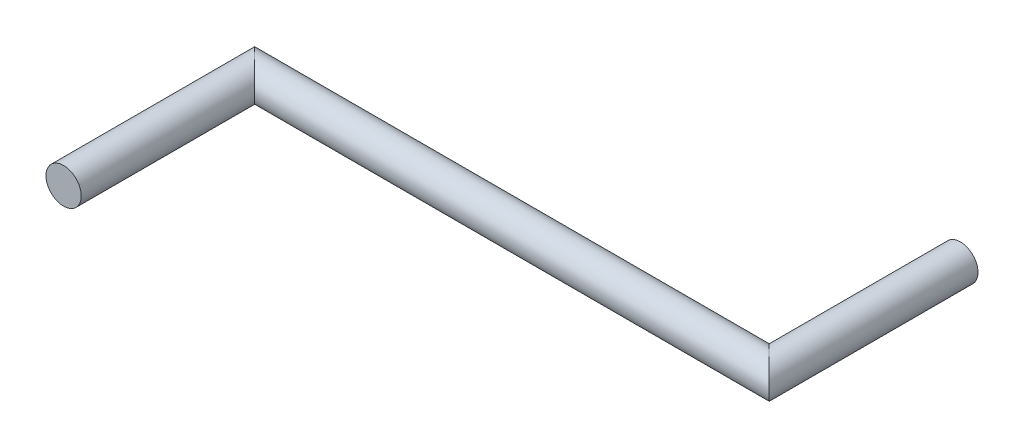
ISO-10303-21;
HEADER;
FILE_DESCRIPTION(('STEP AP214'),'2;1');
FILE_NAME('part.step','',(''),(''),'','','');
FILE_SCHEMA(('AUTOMOTIVE_DESIGN { 1 0 10303 214 1 1 1 1 }'));
ENDSEC;
DATA;
#1=APPLICATION_CONTEXT('core data for automotive mechanical design processes');
#2=APPLICATION_PROTOCOL_DEFINITION('international standard','automotive_design',2000,#1);
#3=PRODUCT_CONTEXT('',#1,'mechanical');
#4=PRODUCT('Part','Part','',(#3));
#5=PRODUCT_RELATED_PRODUCT_CATEGORY('part','',(#4));
#6=PRODUCT_DEFINITION_FORMATION('','',#4);
#7=PRODUCT_DEFINITION_CONTEXT('part definition',#1,'design');
#8=PRODUCT_DEFINITION('design','',#6,#7);
#9=PRODUCT_DEFINITION_SHAPE('','',#8);
#10=(LENGTH_UNIT() NAMED_UNIT(*) SI_UNIT(.MILLI.,.METRE.));
#11=(NAMED_UNIT(*) PLANE_ANGLE_UNIT() SI_UNIT($,.RADIAN.));
#12=(NAMED_UNIT(*) SI_UNIT($,.STERADIAN.) SOLID_ANGLE_UNIT());
#13=UNCERTAINTY_MEASURE_WITH_UNIT(LENGTH_MEASURE(1.E-05),#10,'distance_accuracy_value','');
#14=(GEOMETRIC_REPRESENTATION_CONTEXT(3) GLOBAL_UNCERTAINTY_ASSIGNED_CONTEXT((#13)) GLOBAL_UNIT_ASSIGNED_CONTEXT((#10,
#11,#12)) REPRESENTATION_CONTEXT('',''));
#15=CARTESIAN_POINT('',(0.,0.,0.));
#16=DIRECTION('',(0.,0.,1.));
#17=DIRECTION('',(1.,0.,0.));
#18=AXIS2_PLACEMENT_3D('',#15,#16,#17);
#19=CARTESIAN_POINT('',(-8.75,0.,6.5));
#20=DIRECTION('',(0.,0.,1.));
#21=DIRECTION('',(1.,0.,0.));
#22=AXIS2_PLACEMENT_3D('',#19,#20,#21);
#23=PLANE('',#22);
#24=CARTESIAN_POINT('',(-8.75,0.,6.5));
#25=DIRECTION('',(0.,0.,1.));
#26=DIRECTION('',(1.,0.,0.));
#27=AXIS2_PLACEMENT_3D('',#24,#25,#26);
#28=CIRCLE('',#27,0.6);
#29=CARTESIAN_POINT('',(-8.15,0.,6.5));
#30=VERTEX_POINT('',#29);
#31=EDGE_CURVE('E38',#30,#30,#28,.T.);
#32=ORIENTED_EDGE('',*,*,#31,.T.);
#33=EDGE_LOOP('',(#32));
#34=FACE_BOUND('',#33,.T.);
#35=ADVANCED_FACE('F35',(#34),#23,.T.);
#36=CARTESIAN_POINT('',(8.75,0.,-6.5));
#37=DIRECTION('',(0.,0.,1.));
#38=DIRECTION('',(1.,0.,0.));
#39=AXIS2_PLACEMENT_3D('',#36,#37,#38);
#40=PLANE('',#39);
#41=CARTESIAN_POINT('',(8.75,0.,-6.5));
#42=DIRECTION('',(0.,0.,1.));
#43=DIRECTION('',(1.,0.,0.));
#44=AXIS2_PLACEMENT_3D('',#41,#42,#43);
#45=CIRCLE('',#44,0.6);
#46=CARTESIAN_POINT('',(9.35,0.,-6.5));
#47=VERTEX_POINT('',#46);
#48=EDGE_CURVE('E42',#47,#47,#45,.T.);
#49=ORIENTED_EDGE('',*,*,#48,.F.);
#50=EDGE_LOOP('',(#49));
#51=FACE_BOUND('',#50,.T.);
#52=ADVANCED_FACE('F59',(#51),#40,.F.);
#53=CARTESIAN_POINT('',(-8.75,0.,-0.760000000000001));
#54=DIRECTION('',(0.,0.,1.));
#55=DIRECTION('',(1.,0.,0.));
#56=AXIS2_PLACEMENT_3D('',#53,#54,#55);
#57=CYLINDRICAL_SURFACE('',#56,0.6);
#58=CARTESIAN_POINT('',(-8.75,0.,0.));
#59=DIRECTION('',(-0.707106781186547,0.,0.707106781186548));
#60=DIRECTION('',(-0.707106781186548,0.,-0.707106781186547));
#61=AXIS2_PLACEMENT_3D('',#58,#59,#60);
#62=ELLIPSE('',#61,0.848528137423857,0.6);
#63=CARTESIAN_POINT('',(-9.35,0.,-0.6));
#64=VERTEX_POINT('',#63);
#65=EDGE_CURVE('E47',#64,#64,#62,.F.);
#66=ORIENTED_EDGE('',*,*,#65,.F.);
#67=EDGE_LOOP('',(#66));
#68=FACE_BOUND('',#67,.T.);
#69=ORIENTED_EDGE('',*,*,#31,.F.);
#70=EDGE_LOOP('',(#69));
#71=FACE_BOUND('',#70,.T.);
#72=ADVANCED_FACE('F56',(#68,#71),#57,.T.);
#73=CARTESIAN_POINT('',(9.51,0.,0.));
#74=DIRECTION('',(-1.,0.,0.));
#75=DIRECTION('',(0.,0.,1.));
#76=AXIS2_PLACEMENT_3D('',#73,#74,#75);
#77=CYLINDRICAL_SURFACE('',#76,0.6);
#78=CARTESIAN_POINT('',(8.75,0.,0.));
#79=DIRECTION('',(-0.707106781186547,0.,0.707106781186548));
#80=DIRECTION('',(0.707106781186548,0.,0.707106781186547));
#81=AXIS2_PLACEMENT_3D('',#78,#79,#80);
#82=ELLIPSE('',#81,0.848528137423857,0.6);
#83=CARTESIAN_POINT('',(9.35,0.,0.599999999999996));
#84=VERTEX_POINT('',#83);
#85=EDGE_CURVE('E10',#84,#84,#82,.F.);
#86=ORIENTED_EDGE('',*,*,#85,.F.);
#87=EDGE_LOOP('',(#86));
#88=FACE_BOUND('',#87,.T.);
#89=ORIENTED_EDGE('',*,*,#65,.T.);
#90=EDGE_LOOP('',(#89));
#91=FACE_BOUND('',#90,.T.);
#92=ADVANCED_FACE('F58',(#88,#91),#77,.T.);
#93=CARTESIAN_POINT('',(8.75,0.,-6.5));
#94=DIRECTION('',(0.,0.,1.));
#95=DIRECTION('',(1.,0.,0.));
#96=AXIS2_PLACEMENT_3D('',#93,#94,#95);
#97=CYLINDRICAL_SURFACE('',#96,0.6);
#98=ORIENTED_EDGE('',*,*,#48,.T.);
#99=EDGE_LOOP('',(#98));
#100=FACE_BOUND('',#99,.T.);
#101=ORIENTED_EDGE('',*,*,#85,.T.);
#102=EDGE_LOOP('',(#101));
#103=FACE_BOUND('',#102,.T.);
#104=ADVANCED_FACE('F66',(#100,#103),#97,.T.);
#105=CLOSED_SHELL('',(#35,#52,#72,#92,#104));
#106=MANIFOLD_SOLID_BREP('B2',#105);
#107=ADVANCED_BREP_SHAPE_REPRESENTATION('',(#18,#106),#14);
#108=SHAPE_DEFINITION_REPRESENTATION(#9,#107);
ENDSEC;
END-ISO-10303-21;
